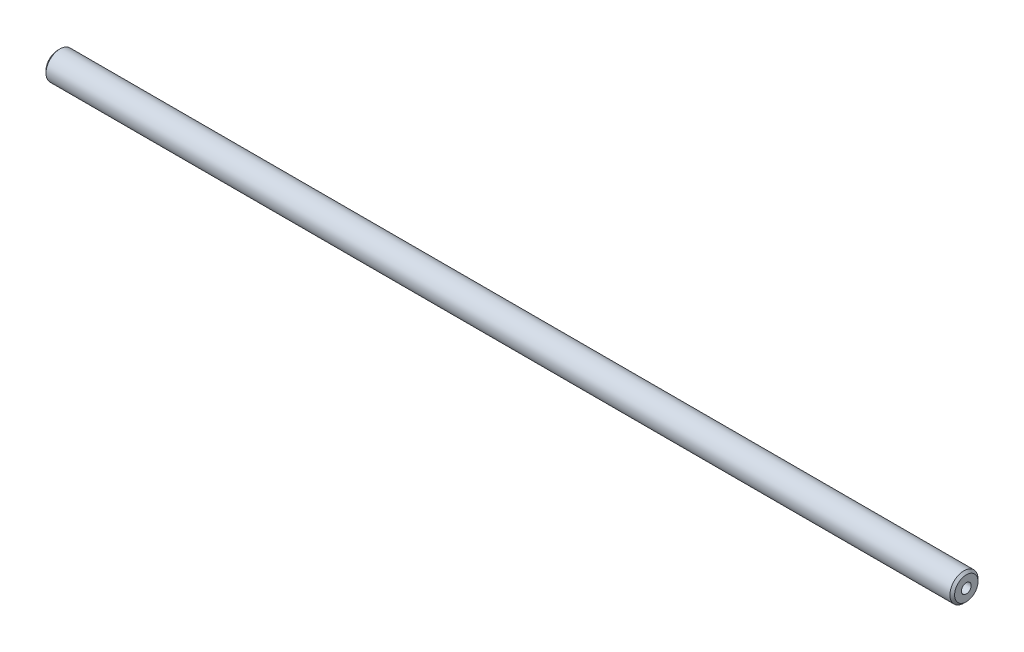
ISO-10303-21;
HEADER;
FILE_DESCRIPTION(('STEP AP214'),'2;1');
FILE_NAME('part.step','',(''),(''),'','','');
FILE_SCHEMA(('AUTOMOTIVE_DESIGN { 1 0 10303 214 1 1 1 1 }'));
ENDSEC;
DATA;
#1=APPLICATION_CONTEXT('core data for automotive mechanical design processes');
#2=APPLICATION_PROTOCOL_DEFINITION('international standard','automotive_design',2000,#1);
#3=PRODUCT_CONTEXT('',#1,'mechanical');
#4=PRODUCT('Part','Part','',(#3));
#5=PRODUCT_RELATED_PRODUCT_CATEGORY('part','',(#4));
#6=PRODUCT_DEFINITION_FORMATION('','',#4);
#7=PRODUCT_DEFINITION_CONTEXT('part definition',#1,'design');
#8=PRODUCT_DEFINITION('design','',#6,#7);
#9=PRODUCT_DEFINITION_SHAPE('','',#8);
#10=(LENGTH_UNIT() NAMED_UNIT(*) SI_UNIT(.MILLI.,.METRE.));
#11=(NAMED_UNIT(*) PLANE_ANGLE_UNIT() SI_UNIT($,.RADIAN.));
#12=(NAMED_UNIT(*) SI_UNIT($,.STERADIAN.) SOLID_ANGLE_UNIT());
#13=UNCERTAINTY_MEASURE_WITH_UNIT(LENGTH_MEASURE(1.E-05),#10,'distance_accuracy_value','');
#14=(GEOMETRIC_REPRESENTATION_CONTEXT(3) GLOBAL_UNCERTAINTY_ASSIGNED_CONTEXT((#13)) GLOBAL_UNIT_ASSIGNED_CONTEXT((#10,
#11,#12)) REPRESENTATION_CONTEXT('',''));
#15=CARTESIAN_POINT('',(0.,0.,0.));
#16=DIRECTION('',(0.,0.,1.));
#17=DIRECTION('',(1.,0.,0.));
#18=AXIS2_PLACEMENT_3D('',#15,#16,#17);
#19=CARTESIAN_POINT('',(388.,0.,0.));
#20=DIRECTION('',(-1.,0.,0.));
#21=DIRECTION('',(0.,0.,1.));
#22=AXIS2_PLACEMENT_3D('',#19,#20,#21);
#23=CYLINDRICAL_SURFACE('',#22,6.);
#24=CARTESIAN_POINT('',(387.,0.,0.));
#25=DIRECTION('',(1.,0.,0.));
#26=DIRECTION('',(0.,0.,-1.));
#27=AXIS2_PLACEMENT_3D('',#24,#25,#26);
#28=CIRCLE('',#27,6.);
#29=CARTESIAN_POINT('',(387.,0.,6.));
#30=VERTEX_POINT('',#29);
#31=EDGE_CURVE('E45',#30,#30,#28,.F.);
#32=CARTESIAN_POINT('',(1.00000000000011,0.,0.));
#33=DIRECTION('',(1.,0.,0.));
#34=DIRECTION('',(0.,0.,-1.));
#35=AXIS2_PLACEMENT_3D('',#32,#33,#34);
#36=CIRCLE('',#35,6.);
#37=CARTESIAN_POINT('',(1.00000000000006,0.,6.));
#38=VERTEX_POINT('',#37);
#39=EDGE_CURVE('E75',#38,#38,#36,.T.);
#40=CARTESIAN_POINT('',(387.,0.,6.));
#41=CARTESIAN_POINT('',(382.979166666667,0.,6.));
#42=CARTESIAN_POINT('',(378.958333333333,0.,6.));
#43=CARTESIAN_POINT('',(370.916666666667,0.,6.));
#44=CARTESIAN_POINT('',(366.895833333333,0.,6.));
#45=CARTESIAN_POINT('',(358.854166666667,0.,6.));
#46=CARTESIAN_POINT('',(354.833333333333,0.,6.));
#47=CARTESIAN_POINT('',(346.791666666667,0.,6.));
#48=CARTESIAN_POINT('',(342.770833333333,0.,6.));
#49=CARTESIAN_POINT('',(334.729166666667,0.,6.));
#50=CARTESIAN_POINT('',(330.708333333333,0.,6.));
#51=CARTESIAN_POINT('',(322.666666666667,0.,6.));
#52=CARTESIAN_POINT('',(318.645833333333,0.,6.));
#53=CARTESIAN_POINT('',(310.604166666667,0.,6.));
#54=CARTESIAN_POINT('',(306.583333333333,0.,6.));
#55=CARTESIAN_POINT('',(298.541666666667,0.,6.));
#56=CARTESIAN_POINT('',(294.520833333333,0.,6.));
#57=CARTESIAN_POINT('',(286.479166666667,0.,6.));
#58=CARTESIAN_POINT('',(282.458333333333,0.,6.));
#59=CARTESIAN_POINT('',(274.416666666667,0.,6.));
#60=CARTESIAN_POINT('',(270.395833333333,0.,6.));
#61=CARTESIAN_POINT('',(262.354166666667,0.,6.));
#62=CARTESIAN_POINT('',(258.333333333333,0.,6.));
#63=CARTESIAN_POINT('',(250.291666666667,0.,6.));
#64=CARTESIAN_POINT('',(246.270833333333,0.,6.));
#65=CARTESIAN_POINT('',(238.229166666667,0.,6.));
#66=CARTESIAN_POINT('',(234.208333333333,0.,6.));
#67=CARTESIAN_POINT('',(226.166666666667,0.,6.));
#68=CARTESIAN_POINT('',(222.145833333333,0.,6.));
#69=CARTESIAN_POINT('',(214.104166666667,0.,6.));
#70=CARTESIAN_POINT('',(210.083333333333,0.,6.));
#71=CARTESIAN_POINT('',(202.041666666667,0.,6.));
#72=CARTESIAN_POINT('',(198.020833333333,0.,6.));
#73=CARTESIAN_POINT('',(189.979166666667,0.,6.));
#74=CARTESIAN_POINT('',(185.958333333333,0.,6.));
#75=CARTESIAN_POINT('',(177.916666666667,0.,6.));
#76=CARTESIAN_POINT('',(173.895833333333,0.,6.));
#77=CARTESIAN_POINT('',(165.854166666667,0.,6.));
#78=CARTESIAN_POINT('',(161.833333333333,0.,6.));
#79=CARTESIAN_POINT('',(153.791666666667,0.,6.));
#80=CARTESIAN_POINT('',(149.770833333333,0.,6.));
#81=CARTESIAN_POINT('',(141.729166666667,0.,6.));
#82=CARTESIAN_POINT('',(137.708333333333,0.,6.));
#83=CARTESIAN_POINT('',(129.666666666667,0.,6.));
#84=CARTESIAN_POINT('',(125.645833333333,0.,6.));
#85=CARTESIAN_POINT('',(117.604166666667,0.,6.));
#86=CARTESIAN_POINT('',(113.583333333333,0.,6.));
#87=CARTESIAN_POINT('',(105.541666666667,0.,6.));
#88=CARTESIAN_POINT('',(101.520833333333,0.,6.));
#89=CARTESIAN_POINT('',(93.4791666666668,0.,6.));
#90=CARTESIAN_POINT('',(89.4583333333334,0.,6.));
#91=CARTESIAN_POINT('',(81.4166666666668,0.,6.));
#92=CARTESIAN_POINT('',(77.3958333333335,0.,6.));
#93=CARTESIAN_POINT('',(69.3541666666668,0.,6.));
#94=CARTESIAN_POINT('',(65.3333333333334,0.,6.));
#95=CARTESIAN_POINT('',(57.2916666666667,0.,6.));
#96=CARTESIAN_POINT('',(53.2708333333334,0.,6.));
#97=CARTESIAN_POINT('',(45.2291666666667,0.,6.));
#98=CARTESIAN_POINT('',(41.2083333333334,0.,6.));
#99=CARTESIAN_POINT('',(33.1666666666668,0.,6.));
#100=CARTESIAN_POINT('',(29.1458333333334,0.,6.));
#101=CARTESIAN_POINT('',(21.1041666666668,0.,6.));
#102=CARTESIAN_POINT('',(17.0833333333334,0.,6.));
#103=CARTESIAN_POINT('',(9.04166666666671,0.,6.));
#104=CARTESIAN_POINT('',(5.02083333333338,0.,6.));
#105=CARTESIAN_POINT('',(1.00000000000006,0.,6.));
#106=B_SPLINE_CURVE_WITH_KNOTS('',3,(#40,#41,#42,#43,#44,#45,#46,#47,#48,#49,#50,#51,#52,#53,
#54,#55,#56,#57,#58,#59,#60,#61,#62,#63,#64,#65,#66,#67,#68,#69,#70,#71,#72,#73,#74,#75,#76,#77,
#78,#79,#80,#81,#82,#83,#84,#85,#86,#87,#88,#89,#90,#91,#92,#93,#94,#95,#96,#97,#98,#99,#100,
#101,#102,#103,#104,#105),.UNSPECIFIED.,.F.,.F.,(4,2,2,2,2,2,2,2,2,2,2,2,2,2,2,2,2,2,2,2,2,2,2,
2,2,2,2,2,2,2,2,2,4),(0.,12.0625,24.125,36.1875,48.25,60.3125,72.375,84.4375000000001,96.5,
108.5625,120.625,132.6875,144.75,156.8125,168.875,180.9375,193.,205.0625,217.125,229.1875,
241.25,253.3125,265.375,277.4375,289.5,301.5625,313.625,325.6875,337.75,349.8125,361.875,
373.9375,386.),.UNSPECIFIED.);
#107=EDGE_CURVE('BSEAM37',#30,#38,#106,.T.);
#108=ORIENTED_EDGE('',*,*,#31,.T.);
#109=ORIENTED_EDGE('',*,*,#39,.T.);
#110=ORIENTED_EDGE('',*,*,#107,.T.);
#111=ORIENTED_EDGE('',*,*,#107,.F.);
#112=EDGE_LOOP('',(#108,#110,#109,#111));
#113=FACE_BOUND('',#112,.T.);
#114=ADVANCED_FACE('F37',(#113),#23,.T.);
#115=CARTESIAN_POINT('',(388.,0.,0.));
#116=DIRECTION('',(1.,0.,0.));
#117=DIRECTION('',(0.,0.,-1.));
#118=AXIS2_PLACEMENT_3D('',#115,#116,#117);
#119=PLANE('',#118);
#120=CARTESIAN_POINT('',(388.,0.,0.));
#121=DIRECTION('',(1.,0.,0.));
#122=DIRECTION('',(0.,0.,-1.));
#123=AXIS2_PLACEMENT_3D('',#120,#121,#122);
#124=CIRCLE('',#123,2.09999999999999);
#125=CARTESIAN_POINT('',(388.,0.,-2.09999999999999));
#126=VERTEX_POINT('',#125);
#127=EDGE_CURVE('E61',#126,#126,#124,.T.);
#128=ORIENTED_EDGE('',*,*,#127,.F.);
#129=EDGE_LOOP('',(#128));
#130=FACE_BOUND('',#129,.T.);
#131=CARTESIAN_POINT('',(388.,0.,0.));
#132=DIRECTION('',(1.,0.,0.));
#133=DIRECTION('',(0.,0.,-1.));
#134=AXIS2_PLACEMENT_3D('',#131,#132,#133);
#135=CIRCLE('',#134,5.00000000000011);
#136=CARTESIAN_POINT('',(388.,0.,-5.00000000000011));
#137=VERTEX_POINT('',#136);
#138=EDGE_CURVE('E72',#137,#137,#135,.T.);
#139=ORIENTED_EDGE('',*,*,#138,.T.);
#140=EDGE_LOOP('',(#139));
#141=FACE_BOUND('',#140,.T.);
#142=ADVANCED_FACE('F88',(#130,#141),#119,.T.);
#143=CARTESIAN_POINT('',(0.,0.,0.));
#144=DIRECTION('',(1.,0.,0.));
#145=DIRECTION('',(0.,0.,-1.));
#146=AXIS2_PLACEMENT_3D('',#143,#144,#145);
#147=PLANE('',#146);
#148=CARTESIAN_POINT('',(0.,0.,0.));
#149=DIRECTION('',(-1.,0.,0.));
#150=DIRECTION('',(0.,0.,1.));
#151=AXIS2_PLACEMENT_3D('',#148,#149,#150);
#152=CIRCLE('',#151,2.09999999999999);
#153=CARTESIAN_POINT('',(0.,0.,2.09999999999999));
#154=VERTEX_POINT('',#153);
#155=EDGE_CURVE('E62',#154,#154,#152,.T.);
#156=ORIENTED_EDGE('',*,*,#155,.F.);
#157=EDGE_LOOP('',(#156));
#158=FACE_BOUND('',#157,.T.);
#159=CARTESIAN_POINT('',(0.,0.,0.));
#160=DIRECTION('',(1.,0.,0.));
#161=DIRECTION('',(0.,0.,-1.));
#162=AXIS2_PLACEMENT_3D('',#159,#160,#161);
#163=CIRCLE('',#162,4.99999999999989);
#164=CARTESIAN_POINT('',(0.,0.,-4.99999999999989));
#165=VERTEX_POINT('',#164);
#166=EDGE_CURVE('E11',#165,#165,#163,.F.);
#167=ORIENTED_EDGE('',*,*,#166,.T.);
#168=EDGE_LOOP('',(#167));
#169=FACE_BOUND('',#168,.T.);
#170=ADVANCED_FACE('F85',(#158,#169),#147,.F.);
#171=CARTESIAN_POINT('',(388.,0.,0.));
#172=DIRECTION('',(-1.,0.,0.));
#173=DIRECTION('',(0.,0.,1.));
#174=AXIS2_PLACEMENT_3D('',#171,#172,#173);
#175=CONICAL_SURFACE('',#174,5.00000000000011,0.785398163397474);
#176=ORIENTED_EDGE('',*,*,#31,.F.);
#177=EDGE_LOOP('',(#176));
#178=FACE_BOUND('',#177,.T.);
#179=ORIENTED_EDGE('',*,*,#138,.F.);
#180=EDGE_LOOP('',(#179));
#181=FACE_BOUND('',#180,.T.);
#182=ADVANCED_FACE('F82',(#178,#181),#175,.T.);
#183=CARTESIAN_POINT('',(1.00000000000011,0.,0.));
#184=DIRECTION('',(1.,0.,0.));
#185=DIRECTION('',(0.,0.,-1.));
#186=AXIS2_PLACEMENT_3D('',#183,#184,#185);
#187=CONICAL_SURFACE('',#186,6.,0.785398163397447);
#188=ORIENTED_EDGE('',*,*,#166,.F.);
#189=EDGE_LOOP('',(#188));
#190=FACE_BOUND('',#189,.T.);
#191=ORIENTED_EDGE('',*,*,#39,.F.);
#192=EDGE_LOOP('',(#191));
#193=FACE_BOUND('',#192,.T.);
#194=ADVANCED_FACE('F39',(#190,#193),#187,.T.);
#195=CARTESIAN_POINT('',(374.,0.,0.));
#196=DIRECTION('',(1.,0.,0.));
#197=DIRECTION('',(0.,0.,-1.));
#198=AXIS2_PLACEMENT_3D('',#195,#196,#197);
#199=CONICAL_SURFACE('',#198,2.1,1.02974425867667);
#200=CARTESIAN_POINT('',(372.738192700042,0.,0.));
#201=VERTEX_POINT('',#200);
#202=VERTEX_LOOP('',#201);
#203=FACE_BOUND('',#202,.T.);
#204=CARTESIAN_POINT('',(374.,0.,0.));
#205=DIRECTION('',(1.,0.,0.));
#206=DIRECTION('',(0.,0.,-1.));
#207=AXIS2_PLACEMENT_3D('',#204,#205,#206);
#208=CIRCLE('',#207,2.1);
#209=CARTESIAN_POINT('',(374.,0.,-2.1));
#210=VERTEX_POINT('',#209);
#211=EDGE_CURVE('E65',#210,#210,#208,.T.);
#212=ORIENTED_EDGE('',*,*,#211,.T.);
#213=EDGE_LOOP('',(#212));
#214=FACE_BOUND('',#213,.T.);
#215=ADVANCED_FACE('F103',(#203,#214),#199,.F.);
#216=CARTESIAN_POINT('',(388.,0.,0.));
#217=DIRECTION('',(1.,0.,0.));
#218=DIRECTION('',(0.,0.,-1.));
#219=AXIS2_PLACEMENT_3D('',#216,#217,#218);
#220=CYLINDRICAL_SURFACE('',#219,2.09999999999999);
#221=ORIENTED_EDGE('',*,*,#211,.F.);
#222=EDGE_LOOP('',(#221));
#223=FACE_BOUND('',#222,.T.);
#224=ORIENTED_EDGE('',*,*,#127,.T.);
#225=EDGE_LOOP('',(#224));
#226=FACE_BOUND('',#225,.T.);
#227=ADVANCED_FACE('F55',(#223,#226),#220,.F.);
#228=CARTESIAN_POINT('',(14.,0.,0.));
#229=DIRECTION('',(-1.,0.,0.));
#230=DIRECTION('',(0.,0.,1.));
#231=AXIS2_PLACEMENT_3D('',#228,#229,#230);
#232=CONICAL_SURFACE('',#231,2.1,1.02974425867665);
#233=CARTESIAN_POINT('',(15.2618072999579,0.,0.));
#234=VERTEX_POINT('',#233);
#235=VERTEX_LOOP('',#234);
#236=FACE_BOUND('',#235,.T.);
#237=CARTESIAN_POINT('',(14.,0.,0.));
#238=DIRECTION('',(-1.,0.,0.));
#239=DIRECTION('',(0.,0.,1.));
#240=AXIS2_PLACEMENT_3D('',#237,#238,#239);
#241=CIRCLE('',#240,2.1);
#242=CARTESIAN_POINT('',(14.,0.,2.1));
#243=VERTEX_POINT('',#242);
#244=EDGE_CURVE('E59',#243,#243,#241,.T.);
#245=ORIENTED_EDGE('',*,*,#244,.T.);
#246=EDGE_LOOP('',(#245));
#247=FACE_BOUND('',#246,.T.);
#248=ADVANCED_FACE('F51',(#236,#247),#232,.F.);
#249=CARTESIAN_POINT('',(0.,0.,0.));
#250=DIRECTION('',(-1.,0.,0.));
#251=DIRECTION('',(0.,0.,1.));
#252=AXIS2_PLACEMENT_3D('',#249,#250,#251);
#253=CYLINDRICAL_SURFACE('',#252,2.09999999999999);
#254=ORIENTED_EDGE('',*,*,#244,.F.);
#255=EDGE_LOOP('',(#254));
#256=FACE_BOUND('',#255,.T.);
#257=ORIENTED_EDGE('',*,*,#155,.T.);
#258=EDGE_LOOP('',(#257));
#259=FACE_BOUND('',#258,.T.);
#260=ADVANCED_FACE('F54',(#256,#259),#253,.F.);
#261=CLOSED_SHELL('',(#114,#142,#170,#182,#194,#215,#227,#248,#260));
#262=MANIFOLD_SOLID_BREP('B2',#261);
#263=ADVANCED_BREP_SHAPE_REPRESENTATION('',(#18,#262),#14);
#264=SHAPE_DEFINITION_REPRESENTATION(#9,#263);
ENDSEC;
END-ISO-10303-21;
